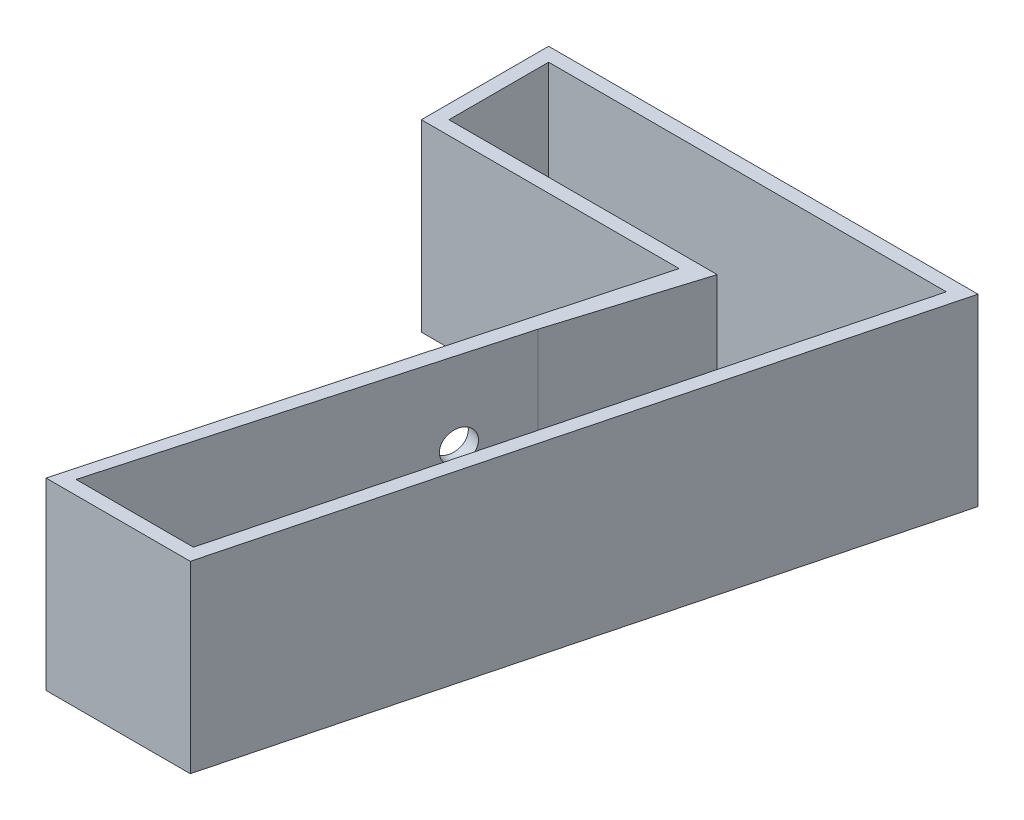
ISO-10303-21;
HEADER;
FILE_DESCRIPTION(('STEP AP214'),'2;1');
FILE_NAME('part.step','',(''),(''),'','','');
FILE_SCHEMA(('AUTOMOTIVE_DESIGN { 1 0 10303 214 1 1 1 1 }'));
ENDSEC;
DATA;
#1=APPLICATION_CONTEXT('core data for automotive mechanical design processes');
#2=APPLICATION_PROTOCOL_DEFINITION('international standard','automotive_design',2000,#1);
#3=PRODUCT_CONTEXT('',#1,'mechanical');
#4=PRODUCT('Part','Part','',(#3));
#5=PRODUCT_RELATED_PRODUCT_CATEGORY('part','',(#4));
#6=PRODUCT_DEFINITION_FORMATION('','',#4);
#7=PRODUCT_DEFINITION_CONTEXT('part definition',#1,'design');
#8=PRODUCT_DEFINITION('design','',#6,#7);
#9=PRODUCT_DEFINITION_SHAPE('','',#8);
#10=(LENGTH_UNIT() NAMED_UNIT(*) SI_UNIT(.MILLI.,.METRE.));
#11=(NAMED_UNIT(*) PLANE_ANGLE_UNIT() SI_UNIT($,.RADIAN.));
#12=(NAMED_UNIT(*) SI_UNIT($,.STERADIAN.) SOLID_ANGLE_UNIT());
#13=UNCERTAINTY_MEASURE_WITH_UNIT(LENGTH_MEASURE(1.E-05),#10,'distance_accuracy_value','');
#14=(GEOMETRIC_REPRESENTATION_CONTEXT(3) GLOBAL_UNCERTAINTY_ASSIGNED_CONTEXT((#13)) GLOBAL_UNIT_ASSIGNED_CONTEXT((#10,
#11,#12)) REPRESENTATION_CONTEXT('',''));
#15=CARTESIAN_POINT('',(0.,0.,0.));
#16=DIRECTION('',(0.,0.,1.));
#17=DIRECTION('',(1.,0.,0.));
#18=AXIS2_PLACEMENT_3D('',#15,#16,#17);
#19=CARTESIAN_POINT('',(7.75866869615772,4.02,54.1609669938169));
#20=DIRECTION('',(0.,-1.,0.));
#21=DIRECTION('',(0.,0.,-1.));
#22=AXIS2_PLACEMENT_3D('',#19,#20,#21);
#23=CYLINDRICAL_SURFACE('',#22,2.75);
#24=CARTESIAN_POINT('',(7.75866869615772,4.02,54.1609669938169));
#25=DIRECTION('',(0.,1.,0.));
#26=DIRECTION('',(0.,0.,1.));
#27=AXIS2_PLACEMENT_3D('',#24,#25,#26);
#28=CIRCLE('',#27,2.75);
#29=CARTESIAN_POINT('',(7.75866869615772,4.02,56.9109669938169));
#30=VERTEX_POINT('',#29);
#31=EDGE_CURVE('E47',#30,#30,#28,.T.);
#32=ORIENTED_EDGE('',*,*,#31,.F.);
#33=EDGE_LOOP('',(#32));
#34=FACE_BOUND('',#33,.T.);
#35=CARTESIAN_POINT('',(7.75866869615772,0.,54.1609669938169));
#36=DIRECTION('',(0.,1.,0.));
#37=DIRECTION('',(0.,0.,1.));
#38=AXIS2_PLACEMENT_3D('',#35,#36,#37);
#39=CIRCLE('',#38,2.75);
#40=CARTESIAN_POINT('',(7.75866869615772,0.,56.9109669938169));
#41=VERTEX_POINT('',#40);
#42=EDGE_CURVE('E11',#41,#41,#39,.T.);
#43=ORIENTED_EDGE('',*,*,#42,.T.);
#44=EDGE_LOOP('',(#43));
#45=FACE_BOUND('',#44,.T.);
#46=ADVANCED_FACE('F44',(#34,#45),#23,.T.);
#47=CARTESIAN_POINT('',(7.75866869615772,4.02,54.1609669938169));
#48=DIRECTION('',(0.,1.,0.));
#49=DIRECTION('',(0.,0.,1.));
#50=AXIS2_PLACEMENT_3D('',#47,#48,#49);
#51=PLANE('',#50);
#52=CARTESIAN_POINT('',(7.75866869615772,4.02,54.1609669938169));
#53=DIRECTION('',(0.,1.,0.));
#54=DIRECTION('',(0.,0.,1.));
#55=AXIS2_PLACEMENT_3D('',#52,#53,#54);
#56=CIRCLE('',#55,2.225);
#57=CARTESIAN_POINT('',(7.75866869615772,4.02,56.3859669938169));
#58=VERTEX_POINT('',#57);
#59=EDGE_CURVE('E57',#58,#58,#56,.T.);
#60=ORIENTED_EDGE('',*,*,#59,.F.);
#61=EDGE_LOOP('',(#60));
#62=FACE_BOUND('',#61,.T.);
#63=ORIENTED_EDGE('',*,*,#31,.T.);
#64=EDGE_LOOP('',(#63));
#65=FACE_BOUND('',#64,.T.);
#66=ADVANCED_FACE('F50',(#62,#65),#51,.T.);
#67=CARTESIAN_POINT('',(7.75866869615772,0.,54.1609669938169));
#68=DIRECTION('',(0.,1.,0.));
#69=DIRECTION('',(0.,0.,1.));
#70=AXIS2_PLACEMENT_3D('',#67,#68,#69);
#71=PLANE('',#70);
#72=CARTESIAN_POINT('',(7.75866869615772,0.,54.1609669938169));
#73=DIRECTION('',(0.,1.,0.));
#74=DIRECTION('',(0.,0.,1.));
#75=AXIS2_PLACEMENT_3D('',#72,#73,#74);
#76=CIRCLE('',#75,2.225);
#77=CARTESIAN_POINT('',(7.75866869615772,0.,56.3859669938169));
#78=VERTEX_POINT('',#77);
#79=EDGE_CURVE('E59',#78,#78,#76,.T.);
#80=ORIENTED_EDGE('',*,*,#79,.T.);
#81=EDGE_LOOP('',(#80));
#82=FACE_BOUND('',#81,.T.);
#83=ORIENTED_EDGE('',*,*,#42,.F.);
#84=EDGE_LOOP('',(#83));
#85=FACE_BOUND('',#84,.T.);
#86=ADVANCED_FACE('F68',(#82,#85),#71,.F.);
#87=CARTESIAN_POINT('',(7.75866869615772,0.,54.1609669938169));
#88=DIRECTION('',(0.,1.,0.));
#89=DIRECTION('',(0.,0.,1.));
#90=AXIS2_PLACEMENT_3D('',#87,#88,#89);
#91=CYLINDRICAL_SURFACE('',#90,2.225);
#92=ORIENTED_EDGE('',*,*,#79,.F.);
#93=EDGE_LOOP('',(#92));
#94=FACE_BOUND('',#93,.T.);
#95=ORIENTED_EDGE('',*,*,#59,.T.);
#96=EDGE_LOOP('',(#95));
#97=FACE_BOUND('',#96,.T.);
#98=ADVANCED_FACE('F64',(#94,#97),#91,.F.);
#99=CLOSED_SHELL('',(#46,#66,#86,#98));
#100=MANIFOLD_SOLID_BREP('B2',#99);
#101=CARTESIAN_POINT('',(-17.598579060663,4.02,-46.2307594645404));
#102=DIRECTION('',(0.,-1.,0.));
#103=DIRECTION('',(0.,0.,-1.));
#104=AXIS2_PLACEMENT_3D('',#101,#102,#103);
#105=CYLINDRICAL_SURFACE('',#104,2.75);
#106=CARTESIAN_POINT('',(-17.598579060663,4.02,-46.2307594645404));
#107=DIRECTION('',(0.,1.,0.));
#108=DIRECTION('',(0.,0.,1.));
#109=AXIS2_PLACEMENT_3D('',#106,#107,#108);
#110=CIRCLE('',#109,2.75);
#111=CARTESIAN_POINT('',(-17.598579060663,4.02,-43.4807594645404));
#112=VERTEX_POINT('',#111);
#113=EDGE_CURVE('E42',#112,#112,#110,.T.);
#114=ORIENTED_EDGE('',*,*,#113,.F.);
#115=EDGE_LOOP('',(#114));
#116=FACE_BOUND('',#115,.T.);
#117=CARTESIAN_POINT('',(-17.598579060663,0.,-46.2307594645404));
#118=DIRECTION('',(0.,1.,0.));
#119=DIRECTION('',(0.,0.,1.));
#120=AXIS2_PLACEMENT_3D('',#117,#118,#119);
#121=CIRCLE('',#120,2.75);
#122=CARTESIAN_POINT('',(-17.598579060663,0.,-43.4807594645404));
#123=VERTEX_POINT('',#122);
#124=EDGE_CURVE('E118',#123,#123,#121,.T.);
#125=ORIENTED_EDGE('',*,*,#124,.T.);
#126=EDGE_LOOP('',(#125));
#127=FACE_BOUND('',#126,.T.);
#128=ADVANCED_FACE('F113',(#116,#127),#105,.T.);
#129=CARTESIAN_POINT('',(-17.598579060663,4.02,-46.2307594645404));
#130=DIRECTION('',(0.,1.,0.));
#131=DIRECTION('',(0.,0.,1.));
#132=AXIS2_PLACEMENT_3D('',#129,#130,#131);
#133=PLANE('',#132);
#134=CARTESIAN_POINT('',(-17.598579060663,4.02,-46.2307594645404));
#135=DIRECTION('',(0.,1.,0.));
#136=DIRECTION('',(0.,0.,1.));
#137=AXIS2_PLACEMENT_3D('',#134,#135,#136);
#138=CIRCLE('',#137,2.225);
#139=CARTESIAN_POINT('',(-17.598579060663,4.02,-44.0057594645404));
#140=VERTEX_POINT('',#139);
#141=EDGE_CURVE('E130',#140,#140,#138,.T.);
#142=ORIENTED_EDGE('',*,*,#141,.F.);
#143=EDGE_LOOP('',(#142));
#144=FACE_BOUND('',#143,.T.);
#145=ORIENTED_EDGE('',*,*,#113,.T.);
#146=EDGE_LOOP('',(#145));
#147=FACE_BOUND('',#146,.T.);
#148=ADVANCED_FACE('F142',(#144,#147),#133,.T.);
#149=CARTESIAN_POINT('',(-17.598579060663,0.,-46.2307594645404));
#150=DIRECTION('',(0.,1.,0.));
#151=DIRECTION('',(0.,0.,1.));
#152=AXIS2_PLACEMENT_3D('',#149,#150,#151);
#153=PLANE('',#152);
#154=CARTESIAN_POINT('',(-17.598579060663,0.,-46.2307594645404));
#155=DIRECTION('',(0.,1.,0.));
#156=DIRECTION('',(0.,0.,1.));
#157=AXIS2_PLACEMENT_3D('',#154,#155,#156);
#158=CIRCLE('',#157,2.225);
#159=CARTESIAN_POINT('',(-17.598579060663,0.,-44.0057594645404));
#160=VERTEX_POINT('',#159);
#161=EDGE_CURVE('E121',#160,#160,#158,.T.);
#162=ORIENTED_EDGE('',*,*,#161,.T.);
#163=EDGE_LOOP('',(#162));
#164=FACE_BOUND('',#163,.T.);
#165=ORIENTED_EDGE('',*,*,#124,.F.);
#166=EDGE_LOOP('',(#165));
#167=FACE_BOUND('',#166,.T.);
#168=ADVANCED_FACE('F133',(#164,#167),#153,.F.);
#169=CARTESIAN_POINT('',(-17.598579060663,0.,-46.2307594645404));
#170=DIRECTION('',(0.,1.,0.));
#171=DIRECTION('',(0.,0.,1.));
#172=AXIS2_PLACEMENT_3D('',#169,#170,#171);
#173=CYLINDRICAL_SURFACE('',#172,2.225);
#174=ORIENTED_EDGE('',*,*,#161,.F.);
#175=EDGE_LOOP('',(#174));
#176=FACE_BOUND('',#175,.T.);
#177=ORIENTED_EDGE('',*,*,#141,.T.);
#178=EDGE_LOOP('',(#177));
#179=FACE_BOUND('',#178,.T.);
#180=ADVANCED_FACE('F137',(#176,#179),#173,.F.);
#181=CLOSED_SHELL('',(#128,#148,#168,#180));
#182=MANIFOLD_SOLID_BREP('B6',#181);
#183=CARTESIAN_POINT('',(56.6734669260423,0.,-48.9945518958334));
#184=DIRECTION('',(0.96785190238398,0.,0.251520764653161));
#185=DIRECTION('',(0.251520764653161,0.,-0.96785190238398));
#186=AXIS2_PLACEMENT_3D('',#183,#184,#185);
#187=PLANE('',#186);
#188=DIRECTION('',(0.,-1.,0.));
#189=VECTOR('',#188,1.);
#190=CARTESIAN_POINT('',(48.4865987096489,4.02,-17.4914829991964));
#191=LINE('',#190,#189);
#192=CARTESIAN_POINT('',(48.4865987096489,0.,-17.4914829991964));
#193=VERTEX_POINT('',#192);
#194=CARTESIAN_POINT('',(48.4865987096489,4.02,-17.4914829991964));
#195=VERTEX_POINT('',#194);
#196=EDGE_CURVE('E114',#193,#195,#191,.F.);
#197=ORIENTED_EDGE('',*,*,#196,.F.);
#198=DIRECTION('',(0.251520764652815,0.,-0.96785190238407));
#199=VECTOR('',#198,1.);
#200=CARTESIAN_POINT('',(22.9050172662584,0.,80.9464423950171));
#201=LINE('',#200,#199);
#202=CARTESIAN_POINT('',(22.9050172662584,0.,80.9464423950171));
#203=VERTEX_POINT('',#202);
#204=EDGE_CURVE('E295',#203,#193,#201,.T.);
#205=ORIENTED_EDGE('',*,*,#204,.F.);
#206=DIRECTION('',(0.,1.,0.));
#207=VECTOR('',#206,1.);
#208=CARTESIAN_POINT('',(22.9050172662584,0.,80.9464423950171));
#209=LINE('',#208,#207);
#210=CARTESIAN_POINT('',(22.9050172662584,40.,80.9464423950171));
#211=VERTEX_POINT('',#210);
#212=EDGE_CURVE('E352',#203,#211,#209,.T.);
#213=ORIENTED_EDGE('',*,*,#212,.T.);
#214=DIRECTION('',(0.251520764653161,0.,-0.96785190238398));
#215=VECTOR('',#214,1.);
#216=CARTESIAN_POINT('',(56.6734669260423,40.,-48.9945518958334));
#217=LINE('',#216,#215);
#218=CARTESIAN_POINT('',(56.6734669260423,40.,-48.9945518958334));
#219=VERTEX_POINT('',#218);
#220=EDGE_CURVE('E322',#211,#219,#217,.T.);
#221=ORIENTED_EDGE('',*,*,#220,.T.);
#222=DIRECTION('',(0.,1.,0.));
#223=VECTOR('',#222,1.);
#224=CARTESIAN_POINT('',(56.6734669260423,0.,-48.9945518958334));
#225=LINE('',#224,#223);
#226=CARTESIAN_POINT('',(56.6734669260423,0.,-48.9945518958334));
#227=VERTEX_POINT('',#226);
#228=EDGE_CURVE('E349',#227,#219,#225,.T.);
#229=ORIENTED_EDGE('',*,*,#228,.F.);
#230=CARTESIAN_POINT('',(48.5926175323461,0.,-17.8994434289348));
#231=VERTEX_POINT('',#230);
#232=EDGE_CURVE('E305',#231,#227,#201,.T.);
#233=ORIENTED_EDGE('',*,*,#232,.F.);
#234=DIRECTION('',(0.,-1.,0.));
#235=VECTOR('',#234,1.);
#236=CARTESIAN_POINT('',(48.5926175323461,4.02,-17.8994434289349));
#237=LINE('',#236,#235);
#238=CARTESIAN_POINT('',(48.5926175323461,4.02,-17.8994434289348));
#239=VERTEX_POINT('',#238);
#240=EDGE_CURVE('E184',#239,#231,#237,.T.);
#241=ORIENTED_EDGE('',*,*,#240,.F.);
#242=DIRECTION('',(-0.251520764653161,0.,0.96785190238398));
#243=VECTOR('',#242,1.);
#244=CARTESIAN_POINT('',(56.6734669260423,4.02,-48.9945518958334));
#245=LINE('',#244,#243);
#246=EDGE_CURVE('E294',#239,#195,#245,.T.);
#247=ORIENTED_EDGE('',*,*,#246,.T.);
#248=EDGE_LOOP('',(#197,#205,#213,#221,#229,#233,#241,#247));
#249=FACE_BOUND('',#248,.T.);
#250=ADVANCED_FACE('F177',(#249),#187,.F.);
#251=CARTESIAN_POINT('',(-32.8064300635889,40.,-24.3237173628121));
#252=DIRECTION('',(1.,0.,0.));
#253=DIRECTION('',(0.,0.,-1.));
#254=AXIS2_PLACEMENT_3D('',#251,#252,#253);
#255=PLANE('',#254);
#256=DIRECTION('',(0.,0.,1.));
#257=VECTOR('',#256,1.);
#258=CARTESIAN_POINT('',(-32.8064300635889,0.,-24.3237173628121));
#259=LINE('',#258,#257);
#260=CARTESIAN_POINT('',(-32.8064300635889,0.,-51.9945518958334));
#261=VERTEX_POINT('',#260);
#262=CARTESIAN_POINT('',(-32.8064300635889,0.,-24.3237173628121));
#263=VERTEX_POINT('',#262);
#264=EDGE_CURVE('E345',#261,#263,#259,.T.);
#265=ORIENTED_EDGE('',*,*,#264,.T.);
#266=DIRECTION('',(0.,-1.,0.));
#267=VECTOR('',#266,1.);
#268=CARTESIAN_POINT('',(-32.8064300635889,40.,-24.3237173628121));
#269=LINE('',#268,#267);
#270=CARTESIAN_POINT('',(-32.8064300635889,40.,-24.3237173628121));
#271=VERTEX_POINT('',#270);
#272=EDGE_CURVE('E394',#271,#263,#269,.T.);
#273=ORIENTED_EDGE('',*,*,#272,.F.);
#274=DIRECTION('',(0.,0.,1.));
#275=VECTOR('',#274,1.);
#276=CARTESIAN_POINT('',(-32.8064300635889,40.,-24.3237173628121));
#277=LINE('',#276,#275);
#278=CARTESIAN_POINT('',(-32.8064300635889,40.,-51.9945518958334));
#279=VERTEX_POINT('',#278);
#280=EDGE_CURVE('E354',#279,#271,#277,.T.);
#281=ORIENTED_EDGE('',*,*,#280,.F.);
#282=DIRECTION('',(0.,-1.,0.));
#283=VECTOR('',#282,1.);
#284=CARTESIAN_POINT('',(-32.8064300635889,40.,-51.9945518958334));
#285=LINE('',#284,#283);
#286=EDGE_CURVE('E366',#279,#261,#285,.T.);
#287=ORIENTED_EDGE('',*,*,#286,.T.);
#288=EDGE_LOOP('',(#265,#273,#281,#287));
#289=FACE_BOUND('',#288,.T.);
#290=ADVANCED_FACE('F178',(#289),#255,.F.);
#291=CARTESIAN_POINT('',(23.2499762576878,40.,-24.3237173628121));
#292=DIRECTION('',(0.,0.,-1.));
#293=DIRECTION('',(-1.,0.,0.));
#294=AXIS2_PLACEMENT_3D('',#291,#292,#293);
#295=PLANE('',#294);
#296=DIRECTION('',(1.,0.,0.));
#297=VECTOR('',#296,1.);
#298=CARTESIAN_POINT('',(23.2499762576878,0.,-24.3237173628121));
#299=LINE('',#298,#297);
#300=CARTESIAN_POINT('',(23.2499762576878,0.,-24.3237173628121));
#301=VERTEX_POINT('',#300);
#302=EDGE_CURVE('E371',#263,#301,#299,.T.);
#303=ORIENTED_EDGE('',*,*,#302,.T.);
#304=DIRECTION('',(0.,-1.,0.));
#305=VECTOR('',#304,1.);
#306=CARTESIAN_POINT('',(23.2499762576878,40.,-24.3237173628121));
#307=LINE('',#306,#305);
#308=CARTESIAN_POINT('',(23.2499762576878,40.,-24.3237173628121));
#309=VERTEX_POINT('',#308);
#310=EDGE_CURVE('E392',#309,#301,#307,.T.);
#311=ORIENTED_EDGE('',*,*,#310,.F.);
#312=DIRECTION('',(1.,0.,0.));
#313=VECTOR('',#312,1.);
#314=CARTESIAN_POINT('',(23.2499762576878,40.,-24.3237173628121));
#315=LINE('',#314,#313);
#316=EDGE_CURVE('E360',#271,#309,#315,.T.);
#317=ORIENTED_EDGE('',*,*,#316,.F.);
#318=ORIENTED_EDGE('',*,*,#272,.T.);
#319=EDGE_LOOP('',(#303,#311,#317,#318));
#320=FACE_BOUND('',#319,.T.);
#321=ADVANCED_FACE('F449',(#320),#295,.F.);
#322=CARTESIAN_POINT('',(-6.1499322272503,40.,83.9464423950171));
#323=DIRECTION('',(0.96505356737013,0.,0.26205268956106));
#324=DIRECTION('',(0.26205268956106,0.,-0.96505356737013));
#325=AXIS2_PLACEMENT_3D('',#322,#323,#324);
#326=PLANE('',#325);
#327=CARTESIAN_POINT('',(12.5549292165962,22.8011955151207,15.0626110793229));
#328=DIRECTION('',(-0.96505356737013,0.,-0.26205268956106));
#329=DIRECTION('',(-0.26205268956106,0.,0.96505356737013));
#330=AXIS2_PLACEMENT_3D('',#327,#328,#329);
#331=CIRCLE('',#330,3.45);
#332=CARTESIAN_POINT('',(11.6508474376105,22.8011955151207,18.3920458867499));
#333=VERTEX_POINT('',#332);
#334=EDGE_CURVE('E289',#333,#333,#331,.T.);
#335=ORIENTED_EDGE('',*,*,#334,.F.);
#336=EDGE_LOOP('',(#335));
#337=FACE_BOUND('',#336,.T.);
#338=DIRECTION('',(-0.26205268956106,0.,0.96505356737013));
#339=VECTOR('',#338,1.);
#340=CARTESIAN_POINT('',(-6.1499322272503,0.,83.9464423950171));
#341=LINE('',#340,#339);
#342=CARTESIAN_POINT('',(-6.1499322272503,0.,83.9464423950171));
#343=VERTEX_POINT('',#342);
#344=EDGE_CURVE('E373',#301,#343,#341,.T.);
#345=ORIENTED_EDGE('',*,*,#344,.T.);
#346=DIRECTION('',(0.,-1.,0.));
#347=VECTOR('',#346,1.);
#348=CARTESIAN_POINT('',(-6.1499322272503,40.,83.9464423950171));
#349=LINE('',#348,#347);
#350=CARTESIAN_POINT('',(-6.1499322272503,40.,83.9464423950171));
#351=VERTEX_POINT('',#350);
#352=EDGE_CURVE('E389',#351,#343,#349,.T.);
#353=ORIENTED_EDGE('',*,*,#352,.F.);
#354=DIRECTION('',(-0.26205268956106,0.,0.96505356737013));
#355=VECTOR('',#354,1.);
#356=CARTESIAN_POINT('',(-6.1499322272503,40.,83.9464423950171));
#357=LINE('',#356,#355);
#358=EDGE_CURVE('E356',#309,#351,#357,.T.);
#359=ORIENTED_EDGE('',*,*,#358,.F.);
#360=ORIENTED_EDGE('',*,*,#310,.T.);
#361=EDGE_LOOP('',(#345,#353,#359,#360));
#362=FACE_BOUND('',#361,.T.);
#363=ADVANCED_FACE('F472',(#337,#362),#326,.F.);
#364=CARTESIAN_POINT('',(25.2250392660188,40.,83.9464423950171));
#365=DIRECTION('',(0.,0.,-1.));
#366=DIRECTION('',(-1.,0.,0.));
#367=AXIS2_PLACEMENT_3D('',#364,#365,#366);
#368=PLANE('',#367);
#369=DIRECTION('',(1.,0.,0.));
#370=VECTOR('',#369,1.);
#371=CARTESIAN_POINT('',(25.2250392660188,0.,83.9464423950171));
#372=LINE('',#371,#370);
#373=CARTESIAN_POINT('',(25.2250392660188,0.,83.9464423950171));
#374=VERTEX_POINT('',#373);
#375=EDGE_CURVE('E374',#343,#374,#372,.T.);
#376=ORIENTED_EDGE('',*,*,#375,.T.);
#377=DIRECTION('',(0.,-1.,0.));
#378=VECTOR('',#377,1.);
#379=CARTESIAN_POINT('',(25.2250392660188,40.,83.9464423950171));
#380=LINE('',#379,#378);
#381=CARTESIAN_POINT('',(25.2250392660188,40.,83.9464423950171));
#382=VERTEX_POINT('',#381);
#383=EDGE_CURVE('E384',#382,#374,#380,.T.);
#384=ORIENTED_EDGE('',*,*,#383,.F.);
#385=DIRECTION('',(1.,0.,0.));
#386=VECTOR('',#385,1.);
#387=CARTESIAN_POINT('',(25.2250392660188,40.,83.9464423950171));
#388=LINE('',#387,#386);
#389=EDGE_CURVE('E362',#351,#382,#388,.T.);
#390=ORIENTED_EDGE('',*,*,#389,.F.);
#391=ORIENTED_EDGE('',*,*,#352,.T.);
#392=EDGE_LOOP('',(#376,#384,#390,#391));
#393=FACE_BOUND('',#392,.T.);
#394=ADVANCED_FACE('F468',(#393),#368,.F.);
#395=CARTESIAN_POINT('',(60.5527404850548,40.,-51.9945518958334));
#396=DIRECTION('',(-0.967851902384067,0.,-0.251520764652825));
#397=DIRECTION('',(-0.251520764652825,0.,0.967851902384068));
#398=AXIS2_PLACEMENT_3D('',#395,#396,#397);
#399=PLANE('',#398);
#400=DIRECTION('',(0.251520764652825,0.,-0.967851902384067));
#401=VECTOR('',#400,1.);
#402=CARTESIAN_POINT('',(60.5527404850548,0.,-51.9945518958334));
#403=LINE('',#402,#401);
#404=CARTESIAN_POINT('',(60.5527404850548,0.,-51.9945518958334));
#405=VERTEX_POINT('',#404);
#406=EDGE_CURVE('E380',#374,#405,#403,.T.);
#407=ORIENTED_EDGE('',*,*,#406,.T.);
#408=DIRECTION('',(0.,-1.,0.));
#409=VECTOR('',#408,1.);
#410=CARTESIAN_POINT('',(60.5527404850548,40.,-51.9945518958334));
#411=LINE('',#410,#409);
#412=CARTESIAN_POINT('',(60.5527404850548,40.,-51.9945518958334));
#413=VERTEX_POINT('',#412);
#414=EDGE_CURVE('E385',#413,#405,#411,.T.);
#415=ORIENTED_EDGE('',*,*,#414,.F.);
#416=DIRECTION('',(0.251520764652825,0.,-0.967851902384067));
#417=VECTOR('',#416,1.);
#418=CARTESIAN_POINT('',(60.5527404850548,40.,-51.9945518958334));
#419=LINE('',#418,#417);
#420=EDGE_CURVE('E365',#382,#413,#419,.T.);
#421=ORIENTED_EDGE('',*,*,#420,.F.);
#422=ORIENTED_EDGE('',*,*,#383,.T.);
#423=EDGE_LOOP('',(#407,#415,#421,#422));
#424=FACE_BOUND('',#423,.T.);
#425=ADVANCED_FACE('F464',(#424),#399,.F.);
#426=CARTESIAN_POINT('',(-32.8064300635889,40.,-51.9945518958334));
#427=DIRECTION('',(0.,0.,1.));
#428=DIRECTION('',(1.,0.,0.));
#429=AXIS2_PLACEMENT_3D('',#426,#427,#428);
#430=PLANE('',#429);
#431=DIRECTION('',(-1.,0.,0.));
#432=VECTOR('',#431,1.);
#433=CARTESIAN_POINT('',(-32.8064300635889,0.,-51.9945518958334));
#434=LINE('',#433,#432);
#435=EDGE_CURVE('E358',#405,#261,#434,.T.);
#436=ORIENTED_EDGE('',*,*,#435,.T.);
#437=ORIENTED_EDGE('',*,*,#286,.F.);
#438=DIRECTION('',(-1.,0.,0.));
#439=VECTOR('',#438,1.);
#440=CARTESIAN_POINT('',(-32.8064300635889,40.,-51.9945518958334));
#441=LINE('',#440,#439);
#442=EDGE_CURVE('E368',#413,#279,#441,.T.);
#443=ORIENTED_EDGE('',*,*,#442,.F.);
#444=ORIENTED_EDGE('',*,*,#414,.T.);
#445=EDGE_LOOP('',(#436,#437,#443,#444));
#446=FACE_BOUND('',#445,.T.);
#447=ADVANCED_FACE('F456',(#446),#430,.F.);
#448=CARTESIAN_POINT('',(0.,40.,0.));
#449=DIRECTION('',(0.,-1.,0.));
#450=DIRECTION('',(0.,0.,-1.));
#451=AXIS2_PLACEMENT_3D('',#448,#449,#450);
#452=PLANE('',#451);
#453=DIRECTION('',(1.,0.,0.));
#454=VECTOR('',#453,1.);
#455=CARTESIAN_POINT('',(-2.60878180758407,40.,80.9464423950171));
#456=LINE('',#455,#454);
#457=CARTESIAN_POINT('',(-2.60878180758407,40.,80.9464423950171));
#458=VERTEX_POINT('',#457);
#459=EDGE_CURVE('E319',#458,#211,#456,.T.);
#460=ORIENTED_EDGE('',*,*,#459,.F.);
#461=DIRECTION('',(-0.268934020051292,0.,0.963158602131057));
#462=VECTOR('',#461,1.);
#463=CARTESIAN_POINT('',(19.3059222386525,40.,2.46125963062254));
#464=LINE('',#463,#462);
#465=CARTESIAN_POINT('',(19.3059222386525,40.,2.46125963062254));
#466=VERTEX_POINT('',#465);
#467=EDGE_CURVE('E197',#466,#458,#464,.T.);
#468=ORIENTED_EDGE('',*,*,#467,.F.);
#469=DIRECTION('',(-0.295468058759658,0.,0.955352618802502));
#470=VECTOR('',#469,1.);
#471=CARTESIAN_POINT('',(28.5177139470191,40.,-27.3237173628121));
#472=LINE('',#471,#470);
#473=CARTESIAN_POINT('',(28.5177139470191,40.,-27.3237173628121));
#474=VERTEX_POINT('',#473);
#475=EDGE_CURVE('E337',#474,#466,#472,.T.);
#476=ORIENTED_EDGE('',*,*,#475,.F.);
#477=DIRECTION('',(1.,0.,0.));
#478=VECTOR('',#477,1.);
#479=CARTESIAN_POINT('',(-29.8064300635889,40.,-27.3237173628121));
#480=LINE('',#479,#478);
#481=CARTESIAN_POINT('',(-29.8064300635889,40.,-27.3237173628121));
#482=VERTEX_POINT('',#481);
#483=EDGE_CURVE('E334',#482,#474,#480,.T.);
#484=ORIENTED_EDGE('',*,*,#483,.F.);
#485=DIRECTION('',(0.,0.,1.));
#486=VECTOR('',#485,1.);
#487=CARTESIAN_POINT('',(-29.8064300635889,40.,-48.9945518958334));
#488=LINE('',#487,#486);
#489=CARTESIAN_POINT('',(-29.8064300635889,40.,-48.9945518958334));
#490=VERTEX_POINT('',#489);
#491=EDGE_CURVE('E329',#490,#482,#488,.T.);
#492=ORIENTED_EDGE('',*,*,#491,.F.);
#493=DIRECTION('',(-1.,0.,0.));
#494=VECTOR('',#493,1.);
#495=CARTESIAN_POINT('',(-0.992743821400522,40.,-48.9945518958334));
#496=LINE('',#495,#494);
#497=EDGE_CURVE('E330',#219,#490,#496,.T.);
#498=ORIENTED_EDGE('',*,*,#497,.F.);
#499=ORIENTED_EDGE('',*,*,#220,.F.);
#500=EDGE_LOOP('',(#460,#468,#476,#484,#492,#498,#499));
#501=FACE_BOUND('',#500,.T.);
#502=ORIENTED_EDGE('',*,*,#280,.T.);
#503=ORIENTED_EDGE('',*,*,#316,.T.);
#504=ORIENTED_EDGE('',*,*,#358,.T.);
#505=ORIENTED_EDGE('',*,*,#389,.T.);
#506=ORIENTED_EDGE('',*,*,#420,.T.);
#507=ORIENTED_EDGE('',*,*,#442,.T.);
#508=EDGE_LOOP('',(#502,#503,#504,#505,#506,#507));
#509=FACE_BOUND('',#508,.T.);
#510=ADVANCED_FACE('F416',(#501,#509),#452,.F.);
#511=CARTESIAN_POINT('',(0.,0.,0.));
#512=DIRECTION('',(0.,-1.,0.));
#513=DIRECTION('',(0.,0.,-1.));
#514=AXIS2_PLACEMENT_3D('',#511,#512,#513);
#515=PLANE('',#514);
#516=CARTESIAN_POINT('',(45.8858432594068,0.,-18.3851110471203));
#517=DIRECTION('',(0.,1.,0.));
#518=DIRECTION('',(0.,0.,1.));
#519=AXIS2_PLACEMENT_3D('',#516,#517,#518);
#520=CIRCLE('',#519,2.225);
#521=CARTESIAN_POINT('',(45.8858432594068,0.,-16.1601110471203));
#522=VERTEX_POINT('',#521);
#523=EDGE_CURVE('E618',#522,#522,#520,.T.);
#524=ORIENTED_EDGE('',*,*,#523,.T.);
#525=EDGE_LOOP('',(#524));
#526=FACE_BOUND('',#525,.T.);
#527=ORIENTED_EDGE('',*,*,#204,.T.);
#528=CARTESIAN_POINT('',(45.8858432594068,0.,-18.3851110471203));
#529=DIRECTION('',(0.,1.,0.));
#530=DIRECTION('',(0.,0.,1.));
#531=AXIS2_PLACEMENT_3D('',#528,#529,#530);
#532=CIRCLE('',#531,2.75);
#533=EDGE_CURVE('E282',#231,#193,#532,.T.);
#534=ORIENTED_EDGE('',*,*,#533,.F.);
#535=ORIENTED_EDGE('',*,*,#232,.T.);
#536=DIRECTION('',(-1.,0.,0.));
#537=VECTOR('',#536,1.);
#538=CARTESIAN_POINT('',(56.1807999882741,0.,-48.9945518958334));
#539=LINE('',#538,#537);
#540=CARTESIAN_POINT('',(-29.8064300635889,0.,-48.9945518958334));
#541=VERTEX_POINT('',#540);
#542=EDGE_CURVE('E302',#227,#541,#539,.T.);
#543=ORIENTED_EDGE('',*,*,#542,.T.);
#544=DIRECTION('',(0.,0.,1.));
#545=VECTOR('',#544,1.);
#546=CARTESIAN_POINT('',(-29.8064300635889,0.,-48.9945518958334));
#547=LINE('',#546,#545);
#548=CARTESIAN_POINT('',(-29.8064300635889,0.,-27.3237173628121));
#549=VERTEX_POINT('',#548);
#550=EDGE_CURVE('E301',#541,#549,#547,.T.);
#551=ORIENTED_EDGE('',*,*,#550,.T.);
#552=DIRECTION('',(1.,0.,0.));
#553=VECTOR('',#552,1.);
#554=CARTESIAN_POINT('',(-29.8064300635889,0.,-27.3237173628121));
#555=LINE('',#554,#553);
#556=CARTESIAN_POINT('',(28.5177139470191,0.,-27.3237173628121));
#557=VERTEX_POINT('',#556);
#558=EDGE_CURVE('E315',#549,#557,#555,.T.);
#559=ORIENTED_EDGE('',*,*,#558,.T.);
#560=DIRECTION('',(-0.295468058759658,0.,0.955352618802502));
#561=VECTOR('',#560,1.);
#562=CARTESIAN_POINT('',(28.5177139470191,0.,-27.3237173628121));
#563=LINE('',#562,#561);
#564=CARTESIAN_POINT('',(19.3059222386525,0.,2.46125963062254));
#565=VERTEX_POINT('',#564);
#566=EDGE_CURVE('E312',#557,#565,#563,.T.);
#567=ORIENTED_EDGE('',*,*,#566,.T.);
#568=DIRECTION('',(-0.268934020051292,0.,0.963158602131057));
#569=VECTOR('',#568,1.);
#570=CARTESIAN_POINT('',(19.3059222386525,0.,2.46125963062254));
#571=LINE('',#570,#569);
#572=CARTESIAN_POINT('',(-2.60878180758407,0.,80.9464423950171));
#573=VERTEX_POINT('',#572);
#574=EDGE_CURVE('E339',#565,#573,#571,.T.);
#575=ORIENTED_EDGE('',*,*,#574,.T.);
#576=DIRECTION('',(1.,0.,0.));
#577=VECTOR('',#576,1.);
#578=CARTESIAN_POINT('',(-2.60878180758407,0.,80.9464423950171));
#579=LINE('',#578,#577);
#580=EDGE_CURVE('E296',#573,#203,#579,.T.);
#581=ORIENTED_EDGE('',*,*,#580,.T.);
#582=EDGE_LOOP('',(#527,#534,#535,#543,#551,#559,#567,#575,#581));
#583=FACE_BOUND('',#582,.T.);
#584=ORIENTED_EDGE('',*,*,#264,.F.);
#585=ORIENTED_EDGE('',*,*,#435,.F.);
#586=ORIENTED_EDGE('',*,*,#406,.F.);
#587=ORIENTED_EDGE('',*,*,#375,.F.);
#588=ORIENTED_EDGE('',*,*,#344,.F.);
#589=ORIENTED_EDGE('',*,*,#302,.F.);
#590=EDGE_LOOP('',(#584,#585,#586,#587,#588,#589));
#591=FACE_BOUND('',#590,.T.);
#592=ADVANCED_FACE('F297',(#526,#583,#591),#515,.T.);
#593=CARTESIAN_POINT('',(19.3059222386525,0.,2.46125963062254));
#594=DIRECTION('',(-0.963158602131057,0.,-0.268934020051292));
#595=DIRECTION('',(-0.268934020051292,0.,0.963158602131057));
#596=AXIS2_PLACEMENT_3D('',#593,#594,#595);
#597=PLANE('',#596);
#598=CARTESIAN_POINT('',(15.5595503508863,22.8011955151207,15.8784922655853));
#599=DIRECTION('',(-0.963158602131057,0.,-0.268934020051292));
#600=DIRECTION('',(-0.268934020051292,0.,0.963158602131057));
#601=AXIS2_PLACEMENT_3D('',#598,#599,#600);
#602=ELLIPSE('',#601,3.4500878799529,3.45);
#603=CARTESIAN_POINT('',(14.6317043478004,22.8011955151207,19.2014740852701));
#604=VERTEX_POINT('',#603);
#605=EDGE_CURVE('E321',#604,#604,#602,.T.);
#606=ORIENTED_EDGE('',*,*,#605,.T.);
#607=EDGE_LOOP('',(#606));
#608=FACE_BOUND('',#607,.T.);
#609=ORIENTED_EDGE('',*,*,#467,.T.);
#610=DIRECTION('',(0.,1.,0.));
#611=VECTOR('',#610,1.);
#612=CARTESIAN_POINT('',(-2.60878180758407,0.,80.9464423950171));
#613=LINE('',#612,#611);
#614=EDGE_CURVE('E318',#573,#458,#613,.T.);
#615=ORIENTED_EDGE('',*,*,#614,.F.);
#616=ORIENTED_EDGE('',*,*,#574,.F.);
#617=DIRECTION('',(0.,1.,0.));
#618=VECTOR('',#617,1.);
#619=CARTESIAN_POINT('',(19.3059222386525,0.,2.46125963062254));
#620=LINE('',#619,#618);
#621=EDGE_CURVE('E336',#565,#466,#620,.T.);
#622=ORIENTED_EDGE('',*,*,#621,.T.);
#623=EDGE_LOOP('',(#609,#615,#616,#622));
#624=FACE_BOUND('',#623,.T.);
#625=ADVANCED_FACE('F408',(#608,#624),#597,.F.);
#626=CARTESIAN_POINT('',(28.5177139470191,0.,-27.3237173628121));
#627=DIRECTION('',(-0.955352618802502,0.,-0.295468058759658));
#628=DIRECTION('',(-0.295468058759658,0.,0.955352618802502));
#629=AXIS2_PLACEMENT_3D('',#626,#627,#628);
#630=PLANE('',#629);
#631=ORIENTED_EDGE('',*,*,#475,.T.);
#632=ORIENTED_EDGE('',*,*,#621,.F.);
#633=ORIENTED_EDGE('',*,*,#566,.F.);
#634=DIRECTION('',(0.,1.,0.));
#635=VECTOR('',#634,1.);
#636=CARTESIAN_POINT('',(28.5177139470191,0.,-27.3237173628121));
#637=LINE('',#636,#635);
#638=EDGE_CURVE('E343',#557,#474,#637,.T.);
#639=ORIENTED_EDGE('',*,*,#638,.T.);
#640=EDGE_LOOP('',(#631,#632,#633,#639));
#641=FACE_BOUND('',#640,.T.);
#642=ADVANCED_FACE('F431',(#641),#630,.F.);
#643=CARTESIAN_POINT('',(-29.8064300635889,0.,-27.3237173628121));
#644=DIRECTION('',(0.,0.,1.));
#645=DIRECTION('',(1.,0.,0.));
#646=AXIS2_PLACEMENT_3D('',#643,#644,#645);
#647=PLANE('',#646);
#648=ORIENTED_EDGE('',*,*,#483,.T.);
#649=ORIENTED_EDGE('',*,*,#638,.F.);
#650=ORIENTED_EDGE('',*,*,#558,.F.);
#651=DIRECTION('',(0.,1.,0.));
#652=VECTOR('',#651,1.);
#653=CARTESIAN_POINT('',(-29.8064300635889,0.,-27.3237173628121));
#654=LINE('',#653,#652);
#655=EDGE_CURVE('E341',#549,#482,#654,.T.);
#656=ORIENTED_EDGE('',*,*,#655,.T.);
#657=EDGE_LOOP('',(#648,#649,#650,#656));
#658=FACE_BOUND('',#657,.T.);
#659=ADVANCED_FACE('F428',(#658),#647,.F.);
#660=CARTESIAN_POINT('',(-29.8064300635889,0.,-48.9945518958334));
#661=DIRECTION('',(-1.,0.,0.));
#662=DIRECTION('',(0.,0.,1.));
#663=AXIS2_PLACEMENT_3D('',#660,#661,#662);
#664=PLANE('',#663);
#665=ORIENTED_EDGE('',*,*,#491,.T.);
#666=ORIENTED_EDGE('',*,*,#655,.F.);
#667=ORIENTED_EDGE('',*,*,#550,.F.);
#668=DIRECTION('',(0.,1.,0.));
#669=VECTOR('',#668,1.);
#670=CARTESIAN_POINT('',(-29.8064300635889,0.,-48.9945518958334));
#671=LINE('',#670,#669);
#672=EDGE_CURVE('E350',#541,#490,#671,.T.);
#673=ORIENTED_EDGE('',*,*,#672,.T.);
#674=EDGE_LOOP('',(#665,#666,#667,#673));
#675=FACE_BOUND('',#674,.T.);
#676=ADVANCED_FACE('F426',(#675),#664,.F.);
#677=CARTESIAN_POINT('',(-0.992743821400522,0.,-48.9945518958334));
#678=DIRECTION('',(0.,0.,-1.));
#679=DIRECTION('',(-1.,0.,0.));
#680=AXIS2_PLACEMENT_3D('',#677,#678,#679);
#681=PLANE('',#680);
#682=ORIENTED_EDGE('',*,*,#497,.T.);
#683=ORIENTED_EDGE('',*,*,#672,.F.);
#684=ORIENTED_EDGE('',*,*,#542,.F.);
#685=ORIENTED_EDGE('',*,*,#228,.T.);
#686=EDGE_LOOP('',(#682,#683,#684,#685));
#687=FACE_BOUND('',#686,.T.);
#688=ADVANCED_FACE('F425',(#687),#681,.F.);
#689=CARTESIAN_POINT('',(-2.60878180758407,0.,80.9464423950171));
#690=DIRECTION('',(0.,0.,1.));
#691=DIRECTION('',(1.,0.,0.));
#692=AXIS2_PLACEMENT_3D('',#689,#690,#691);
#693=PLANE('',#692);
#694=ORIENTED_EDGE('',*,*,#459,.T.);
#695=ORIENTED_EDGE('',*,*,#212,.F.);
#696=ORIENTED_EDGE('',*,*,#580,.F.);
#697=ORIENTED_EDGE('',*,*,#614,.T.);
#698=EDGE_LOOP('',(#694,#695,#696,#697));
#699=FACE_BOUND('',#698,.T.);
#700=ADVANCED_FACE('F412',(#699),#693,.F.);
#701=CARTESIAN_POINT('',(22.2054648902975,22.8011955151207,17.6831379749335));
#702=DIRECTION('',(-0.96505356737013,0.,-0.26205268956106));
#703=DIRECTION('',(-0.26205268956106,0.,0.96505356737013));
#704=AXIS2_PLACEMENT_3D('',#701,#702,#703);
#705=CYLINDRICAL_SURFACE('',#704,3.45);
#706=ORIENTED_EDGE('',*,*,#334,.T.);
#707=EDGE_LOOP('',(#706));
#708=FACE_BOUND('',#707,.T.);
#709=ORIENTED_EDGE('',*,*,#605,.F.);
#710=EDGE_LOOP('',(#709));
#711=FACE_BOUND('',#710,.T.);
#712=ADVANCED_FACE('F451',(#708,#711),#705,.F.);
#713=CARTESIAN_POINT('',(45.8858432594068,4.02,-18.3851110471203));
#714=DIRECTION('',(0.,-1.,0.));
#715=DIRECTION('',(0.,0.,-1.));
#716=AXIS2_PLACEMENT_3D('',#713,#714,#715);
#717=CYLINDRICAL_SURFACE('',#716,2.75);
#718=ORIENTED_EDGE('',*,*,#533,.T.);
#719=ORIENTED_EDGE('',*,*,#196,.T.);
#720=CARTESIAN_POINT('',(45.8858432594068,4.02,-18.3851110471203));
#721=DIRECTION('',(0.,1.,0.));
#722=DIRECTION('',(0.,0.,1.));
#723=AXIS2_PLACEMENT_3D('',#720,#721,#722);
#724=CIRCLE('',#723,2.75);
#725=EDGE_CURVE('E186',#239,#195,#724,.T.);
#726=ORIENTED_EDGE('',*,*,#725,.F.);
#727=ORIENTED_EDGE('',*,*,#240,.T.);
#728=EDGE_LOOP('',(#718,#719,#726,#727));
#729=FACE_BOUND('',#728,.T.);
#730=ADVANCED_FACE('F283',(#729),#717,.T.);
#731=CARTESIAN_POINT('',(45.8858432594068,4.02,-18.3851110471203));
#732=DIRECTION('',(0.,1.,0.));
#733=DIRECTION('',(0.,0.,1.));
#734=AXIS2_PLACEMENT_3D('',#731,#732,#733);
#735=PLANE('',#734);
#736=CARTESIAN_POINT('',(45.8858432594068,4.02,-18.3851110471203));
#737=DIRECTION('',(0.,1.,0.));
#738=DIRECTION('',(0.,0.,1.));
#739=AXIS2_PLACEMENT_3D('',#736,#737,#738);
#740=CIRCLE('',#739,2.225);
#741=CARTESIAN_POINT('',(45.8858432594068,4.02,-16.1601110471203));
#742=VERTEX_POINT('',#741);
#743=EDGE_CURVE('E622',#742,#742,#740,.T.);
#744=ORIENTED_EDGE('',*,*,#743,.F.);
#745=EDGE_LOOP('',(#744));
#746=FACE_BOUND('',#745,.T.);
#747=ORIENTED_EDGE('',*,*,#246,.F.);
#748=ORIENTED_EDGE('',*,*,#725,.T.);
#749=EDGE_LOOP('',(#747,#748));
#750=FACE_BOUND('',#749,.T.);
#751=ADVANCED_FACE('F591',(#746,#750),#735,.T.);
#752=CARTESIAN_POINT('',(45.8858432594068,0.,-18.3851110471203));
#753=DIRECTION('',(0.,1.,0.));
#754=DIRECTION('',(0.,0.,1.));
#755=AXIS2_PLACEMENT_3D('',#752,#753,#754);
#756=CYLINDRICAL_SURFACE('',#755,2.225);
#757=ORIENTED_EDGE('',*,*,#523,.F.);
#758=EDGE_LOOP('',(#757));
#759=FACE_BOUND('',#758,.T.);
#760=ORIENTED_EDGE('',*,*,#743,.T.);
#761=EDGE_LOOP('',(#760));
#762=FACE_BOUND('',#761,.T.);
#763=ADVANCED_FACE('F597',(#759,#762),#756,.F.);
#764=CLOSED_SHELL('',(#250,#290,#321,#363,#394,#425,#447,#510,#592,#625,#642,#659,#676,#688,
#700,#712,#730,#751,#763));
#765=MANIFOLD_SOLID_BREP('B39',#764);
#766=ADVANCED_BREP_SHAPE_REPRESENTATION('',(#18,#100,#182,#765),#14);
#767=SHAPE_DEFINITION_REPRESENTATION(#9,#766);
ENDSEC;
END-ISO-10303-21;
